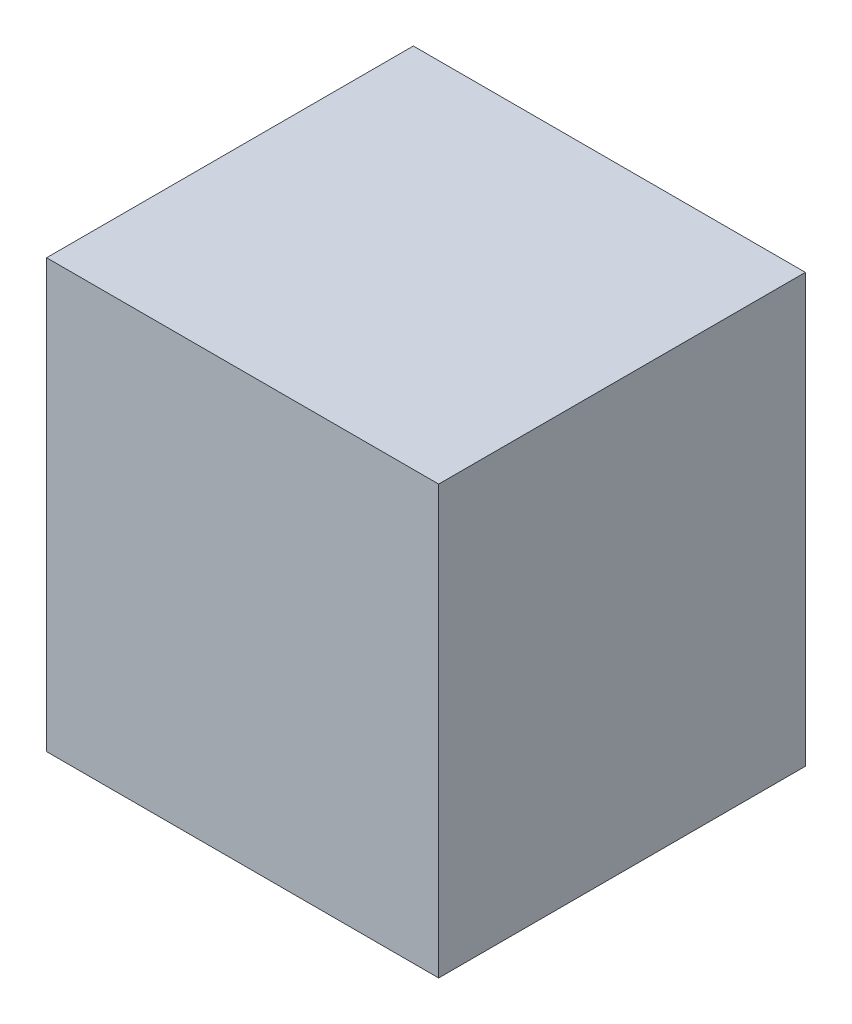
ISO-10303-21;
HEADER;
FILE_DESCRIPTION(('STEP AP214'),'2;1');
FILE_NAME('part.step','',(''),(''),'','','');
FILE_SCHEMA(('AUTOMOTIVE_DESIGN { 1 0 10303 214 1 1 1 1 }'));
ENDSEC;
DATA;
#1=APPLICATION_CONTEXT('core data for automotive mechanical design processes');
#2=APPLICATION_PROTOCOL_DEFINITION('international standard','automotive_design',2000,#1);
#3=PRODUCT_CONTEXT('',#1,'mechanical');
#4=PRODUCT('Part','Part','',(#3));
#5=PRODUCT_RELATED_PRODUCT_CATEGORY('part','',(#4));
#6=PRODUCT_DEFINITION_FORMATION('','',#4);
#7=PRODUCT_DEFINITION_CONTEXT('part definition',#1,'design');
#8=PRODUCT_DEFINITION('design','',#6,#7);
#9=PRODUCT_DEFINITION_SHAPE('','',#8);
#10=(LENGTH_UNIT() NAMED_UNIT(*) SI_UNIT(.MILLI.,.METRE.));
#11=(NAMED_UNIT(*) PLANE_ANGLE_UNIT() SI_UNIT($,.RADIAN.));
#12=(NAMED_UNIT(*) SI_UNIT($,.STERADIAN.) SOLID_ANGLE_UNIT());
#13=UNCERTAINTY_MEASURE_WITH_UNIT(LENGTH_MEASURE(1.E-05),#10,'distance_accuracy_value','');
#14=(GEOMETRIC_REPRESENTATION_CONTEXT(3) GLOBAL_UNCERTAINTY_ASSIGNED_CONTEXT((#13)) GLOBAL_UNIT_ASSIGNED_CONTEXT((#10,
#11,#12)) REPRESENTATION_CONTEXT('',''));
#15=CARTESIAN_POINT('',(0.,0.,0.));
#16=DIRECTION('',(0.,0.,1.));
#17=DIRECTION('',(1.,0.,0.));
#18=AXIS2_PLACEMENT_3D('',#15,#16,#17);
#19=CARTESIAN_POINT('',(4.97886673532662,0.,0.));
#20=DIRECTION('',(0.,1.,0.));
#21=DIRECTION('',(0.,0.,1.));
#22=AXIS2_PLACEMENT_3D('',#19,#20,#21);
#23=PLANE('',#22);
#24=CARTESIAN_POINT('',(-2.48072386230037,0.,33.924));
#25=DIRECTION('',(0.,-1.,0.));
#26=DIRECTION('',(0.,0.,-1.));
#27=AXIS2_PLACEMENT_3D('',#24,#25,#26);
#28=CIRCLE('',#27,2.79999999999999);
#29=CARTESIAN_POINT('',(-2.48072386230037,0.,31.124));
#30=VERTEX_POINT('',#29);
#31=EDGE_CURVE('E135',#30,#30,#28,.T.);
#32=ORIENTED_EDGE('',*,*,#31,.F.);
#33=EDGE_LOOP('',(#32));
#34=FACE_BOUND('',#33,.T.);
#35=CARTESIAN_POINT('',(-2.48072386230037,0.,75.924));
#36=DIRECTION('',(0.,-1.,0.));
#37=DIRECTION('',(0.,0.,-1.));
#38=AXIS2_PLACEMENT_3D('',#35,#36,#37);
#39=CIRCLE('',#38,2.79999999999999);
#40=CARTESIAN_POINT('',(-2.48072386230037,0.,73.124));
#41=VERTEX_POINT('',#40);
#42=EDGE_CURVE('E141',#41,#41,#39,.T.);
#43=ORIENTED_EDGE('',*,*,#42,.F.);
#44=EDGE_LOOP('',(#43));
#45=FACE_BOUND('',#44,.T.);
#46=CARTESIAN_POINT('',(-97.538,0.,75.924));
#47=DIRECTION('',(0.,-1.,0.));
#48=DIRECTION('',(0.,0.,-1.));
#49=AXIS2_PLACEMENT_3D('',#46,#47,#48);
#50=CIRCLE('',#49,2.79999999999999);
#51=CARTESIAN_POINT('',(-97.538,0.,73.124));
#52=VERTEX_POINT('',#51);
#53=EDGE_CURVE('E129',#52,#52,#50,.T.);
#54=ORIENTED_EDGE('',*,*,#53,.F.);
#55=EDGE_LOOP('',(#54));
#56=FACE_BOUND('',#55,.T.);
#57=CARTESIAN_POINT('',(-97.538,0.,33.924));
#58=DIRECTION('',(0.,-1.,0.));
#59=DIRECTION('',(0.,0.,-1.));
#60=AXIS2_PLACEMENT_3D('',#57,#58,#59);
#61=CIRCLE('',#60,2.79999999999999);
#62=CARTESIAN_POINT('',(-97.538,0.,31.124));
#63=VERTEX_POINT('',#62);
#64=EDGE_CURVE('E126',#63,#63,#61,.T.);
#65=ORIENTED_EDGE('',*,*,#64,.F.);
#66=EDGE_LOOP('',(#65));
#67=FACE_BOUND('',#66,.T.);
#68=DIRECTION('',(-1.,0.,0.));
#69=VECTOR('',#68,1.);
#70=CARTESIAN_POINT('',(4.97886673532662,0.,26.924));
#71=LINE('',#70,#69);
#72=CARTESIAN_POINT('',(4.97886673532662,0.,26.924));
#73=VERTEX_POINT('',#72);
#74=CARTESIAN_POINT('',(-104.997590597627,0.,26.924));
#75=VERTEX_POINT('',#74);
#76=EDGE_CURVE('E57',#73,#75,#71,.T.);
#77=ORIENTED_EDGE('',*,*,#76,.F.);
#78=DIRECTION('',(0.,0.,-1.));
#79=VECTOR('',#78,1.);
#80=CARTESIAN_POINT('',(4.97886673532662,0.,0.));
#81=LINE('',#80,#79);
#82=CARTESIAN_POINT('',(4.97886673532662,0.,129.794));
#83=VERTEX_POINT('',#82);
#84=EDGE_CURVE('E103',#83,#73,#81,.T.);
#85=ORIENTED_EDGE('',*,*,#84,.F.);
#86=DIRECTION('',(-1.,0.,0.));
#87=VECTOR('',#86,1.);
#88=CARTESIAN_POINT('',(4.97886673532662,0.,129.794));
#89=LINE('',#88,#87);
#90=CARTESIAN_POINT('',(-104.997590597627,0.,129.794));
#91=VERTEX_POINT('',#90);
#92=EDGE_CURVE('E112',#83,#91,#89,.T.);
#93=ORIENTED_EDGE('',*,*,#92,.T.);
#94=DIRECTION('',(0.,0.,-1.));
#95=VECTOR('',#94,1.);
#96=CARTESIAN_POINT('',(-104.997590597627,0.,0.));
#97=LINE('',#96,#95);
#98=EDGE_CURVE('E101',#91,#75,#97,.T.);
#99=ORIENTED_EDGE('',*,*,#98,.T.);
#100=EDGE_LOOP('',(#77,#85,#93,#99));
#101=FACE_BOUND('',#100,.T.);
#102=ADVANCED_FACE('F43',(#34,#45,#56,#67,#101),#23,.F.);
#103=CARTESIAN_POINT('',(4.97886673532662,119.988,0.));
#104=DIRECTION('',(0.,-1.,0.));
#105=DIRECTION('',(0.,0.,-1.));
#106=AXIS2_PLACEMENT_3D('',#103,#104,#105);
#107=PLANE('',#106);
#108=DIRECTION('',(1.,0.,0.));
#109=VECTOR('',#108,1.);
#110=CARTESIAN_POINT('',(4.97886673532662,119.988,26.924));
#111=LINE('',#110,#109);
#112=CARTESIAN_POINT('',(-104.997590597627,119.988,26.924));
#113=VERTEX_POINT('',#112);
#114=CARTESIAN_POINT('',(4.97886673532662,119.988,26.924));
#115=VERTEX_POINT('',#114);
#116=EDGE_CURVE('E82',#113,#115,#111,.T.);
#117=ORIENTED_EDGE('',*,*,#116,.F.);
#118=DIRECTION('',(0.,0.,1.));
#119=VECTOR('',#118,1.);
#120=CARTESIAN_POINT('',(-104.997590597627,119.988,0.));
#121=LINE('',#120,#119);
#122=CARTESIAN_POINT('',(-104.997590597627,119.988,129.794));
#123=VERTEX_POINT('',#122);
#124=EDGE_CURVE('E92',#113,#123,#121,.T.);
#125=ORIENTED_EDGE('',*,*,#124,.T.);
#126=DIRECTION('',(-1.,0.,0.));
#127=VECTOR('',#126,1.);
#128=CARTESIAN_POINT('',(4.97886673532662,119.988,129.794));
#129=LINE('',#128,#127);
#130=CARTESIAN_POINT('',(4.97886673532662,119.988,129.794));
#131=VERTEX_POINT('',#130);
#132=EDGE_CURVE('E50',#131,#123,#129,.T.);
#133=ORIENTED_EDGE('',*,*,#132,.F.);
#134=DIRECTION('',(0.,0.,1.));
#135=VECTOR('',#134,1.);
#136=CARTESIAN_POINT('',(4.97886673532662,119.988,0.));
#137=LINE('',#136,#135);
#138=EDGE_CURVE('E94',#115,#131,#137,.T.);
#139=ORIENTED_EDGE('',*,*,#138,.F.);
#140=EDGE_LOOP('',(#117,#125,#133,#139));
#141=FACE_BOUND('',#140,.T.);
#142=ADVANCED_FACE('F90',(#141),#107,.F.);
#143=CARTESIAN_POINT('',(4.97886673532662,0.,0.));
#144=DIRECTION('',(-1.,0.,0.));
#145=DIRECTION('',(0.,0.,1.));
#146=AXIS2_PLACEMENT_3D('',#143,#144,#145);
#147=PLANE('',#146);
#148=DIRECTION('',(0.,-1.,0.));
#149=VECTOR('',#148,1.);
#150=CARTESIAN_POINT('',(4.97886673532662,0.,26.924));
#151=LINE('',#150,#149);
#152=EDGE_CURVE('E105',#115,#73,#151,.T.);
#153=ORIENTED_EDGE('',*,*,#152,.F.);
#154=ORIENTED_EDGE('',*,*,#138,.T.);
#155=DIRECTION('',(0.,-1.,0.));
#156=VECTOR('',#155,1.);
#157=CARTESIAN_POINT('',(4.97886673532662,0.,129.794));
#158=LINE('',#157,#156);
#159=EDGE_CURVE('E64',#131,#83,#158,.T.);
#160=ORIENTED_EDGE('',*,*,#159,.T.);
#161=ORIENTED_EDGE('',*,*,#84,.T.);
#162=EDGE_LOOP('',(#153,#154,#160,#161));
#163=FACE_BOUND('',#162,.T.);
#164=ADVANCED_FACE('F117',(#163),#147,.F.);
#165=CARTESIAN_POINT('',(-104.997590597627,0.,0.));
#166=DIRECTION('',(-1.,0.,0.));
#167=DIRECTION('',(0.,0.,1.));
#168=AXIS2_PLACEMENT_3D('',#165,#166,#167);
#169=PLANE('',#168);
#170=ORIENTED_EDGE('',*,*,#124,.F.);
#171=DIRECTION('',(0.,-1.,0.));
#172=VECTOR('',#171,1.);
#173=CARTESIAN_POINT('',(-104.997590597627,0.,26.924));
#174=LINE('',#173,#172);
#175=EDGE_CURVE('E12',#113,#75,#174,.T.);
#176=ORIENTED_EDGE('',*,*,#175,.T.);
#177=ORIENTED_EDGE('',*,*,#98,.F.);
#178=DIRECTION('',(0.,-1.,0.));
#179=VECTOR('',#178,1.);
#180=CARTESIAN_POINT('',(-104.997590597627,0.,129.794));
#181=LINE('',#180,#179);
#182=EDGE_CURVE('E100',#123,#91,#181,.T.);
#183=ORIENTED_EDGE('',*,*,#182,.F.);
#184=EDGE_LOOP('',(#170,#176,#177,#183));
#185=FACE_BOUND('',#184,.T.);
#186=ADVANCED_FACE('F98',(#185),#169,.T.);
#187=CARTESIAN_POINT('',(4.97886673532662,0.,129.794));
#188=DIRECTION('',(0.,0.,-1.));
#189=DIRECTION('',(-1.,0.,0.));
#190=AXIS2_PLACEMENT_3D('',#187,#188,#189);
#191=PLANE('',#190);
#192=ORIENTED_EDGE('',*,*,#132,.T.);
#193=ORIENTED_EDGE('',*,*,#182,.T.);
#194=ORIENTED_EDGE('',*,*,#92,.F.);
#195=ORIENTED_EDGE('',*,*,#159,.F.);
#196=EDGE_LOOP('',(#192,#193,#194,#195));
#197=FACE_BOUND('',#196,.T.);
#198=ADVANCED_FACE('F114',(#197),#191,.F.);
#199=CARTESIAN_POINT('',(-50.0093619311502,59.994,26.924));
#200=DIRECTION('',(0.,0.,-1.));
#201=DIRECTION('',(-1.,0.,0.));
#202=AXIS2_PLACEMENT_3D('',#199,#200,#201);
#203=PLANE('',#202);
#204=CARTESIAN_POINT('',(-50.038,59.994,26.924));
#205=DIRECTION('',(0.,0.,-1.));
#206=DIRECTION('',(-1.,0.,0.));
#207=AXIS2_PLACEMENT_3D('',#204,#205,#206);
#208=CIRCLE('',#207,4.00000000000001);
#209=CARTESIAN_POINT('',(-54.038,59.994,26.924));
#210=VERTEX_POINT('',#209);
#211=EDGE_CURVE('E95',#210,#210,#208,.T.);
#212=ORIENTED_EDGE('',*,*,#211,.F.);
#213=EDGE_LOOP('',(#212));
#214=FACE_BOUND('',#213,.T.);
#215=ORIENTED_EDGE('',*,*,#152,.T.);
#216=ORIENTED_EDGE('',*,*,#76,.T.);
#217=ORIENTED_EDGE('',*,*,#175,.F.);
#218=ORIENTED_EDGE('',*,*,#116,.T.);
#219=EDGE_LOOP('',(#215,#216,#217,#218));
#220=FACE_BOUND('',#219,.T.);
#221=ADVANCED_FACE('F81',(#214,#220),#203,.T.);
#222=CARTESIAN_POINT('',(-50.038,59.994,26.924));
#223=DIRECTION('',(0.,0.,-1.));
#224=DIRECTION('',(-1.,0.,0.));
#225=AXIS2_PLACEMENT_3D('',#222,#223,#224);
#226=CYLINDRICAL_SURFACE('',#225,4.00000000000001);
#227=ORIENTED_EDGE('',*,*,#211,.T.);
#228=EDGE_LOOP('',(#227));
#229=FACE_BOUND('',#228,.T.);
#230=CARTESIAN_POINT('',(-50.038,59.994,0.));
#231=DIRECTION('',(0.,0.,-1.));
#232=DIRECTION('',(-1.,0.,0.));
#233=AXIS2_PLACEMENT_3D('',#230,#231,#232);
#234=CIRCLE('',#233,4.00000000000001);
#235=CARTESIAN_POINT('',(-54.038,59.994,0.));
#236=VERTEX_POINT('',#235);
#237=EDGE_CURVE('E120',#236,#236,#234,.T.);
#238=ORIENTED_EDGE('',*,*,#237,.F.);
#239=EDGE_LOOP('',(#238));
#240=FACE_BOUND('',#239,.T.);
#241=ADVANCED_FACE('F169',(#229,#240),#226,.T.);
#242=CARTESIAN_POINT('',(4.97886673532662,0.,0.));
#243=DIRECTION('',(0.,0.,1.));
#244=DIRECTION('',(1.,0.,0.));
#245=AXIS2_PLACEMENT_3D('',#242,#243,#244);
#246=PLANE('',#245);
#247=ORIENTED_EDGE('',*,*,#237,.T.);
#248=EDGE_LOOP('',(#247));
#249=FACE_BOUND('',#248,.T.);
#250=ADVANCED_FACE('F160',(#249),#246,.F.);
#251=CARTESIAN_POINT('',(-97.538,5.,33.924));
#252=DIRECTION('',(0.,-1.,0.));
#253=DIRECTION('',(0.,0.,-1.));
#254=AXIS2_PLACEMENT_3D('',#251,#252,#253);
#255=CYLINDRICAL_SURFACE('',#254,2.79999999999999);
#256=CARTESIAN_POINT('',(-97.538,5.,33.924));
#257=DIRECTION('',(0.,-1.,0.));
#258=DIRECTION('',(0.,0.,-1.));
#259=AXIS2_PLACEMENT_3D('',#256,#257,#258);
#260=CIRCLE('',#259,2.79999999999999);
#261=CARTESIAN_POINT('',(-97.538,5.,31.124));
#262=VERTEX_POINT('',#261);
#263=EDGE_CURVE('E123',#262,#262,#260,.T.);
#264=ORIENTED_EDGE('',*,*,#263,.F.);
#265=EDGE_LOOP('',(#264));
#266=FACE_BOUND('',#265,.T.);
#267=ORIENTED_EDGE('',*,*,#64,.T.);
#268=EDGE_LOOP('',(#267));
#269=FACE_BOUND('',#268,.T.);
#270=ADVANCED_FACE('F157',(#266,#269),#255,.F.);
#271=CARTESIAN_POINT('',(-97.538,5.,33.924));
#272=DIRECTION('',(0.,-1.,0.));
#273=DIRECTION('',(0.,0.,-1.));
#274=AXIS2_PLACEMENT_3D('',#271,#272,#273);
#275=PLANE('',#274);
#276=ORIENTED_EDGE('',*,*,#263,.T.);
#277=EDGE_LOOP('',(#276));
#278=FACE_BOUND('',#277,.T.);
#279=ADVANCED_FACE('F159',(#278),#275,.T.);
#280=CARTESIAN_POINT('',(-97.538,5.,75.924));
#281=DIRECTION('',(0.,-1.,0.));
#282=DIRECTION('',(0.,0.,-1.));
#283=AXIS2_PLACEMENT_3D('',#280,#281,#282);
#284=CYLINDRICAL_SURFACE('',#283,2.79999999999999);
#285=CARTESIAN_POINT('',(-97.538,5.,75.924));
#286=DIRECTION('',(0.,-1.,0.));
#287=DIRECTION('',(0.,0.,-1.));
#288=AXIS2_PLACEMENT_3D('',#285,#286,#287);
#289=CIRCLE('',#288,2.79999999999999);
#290=CARTESIAN_POINT('',(-97.538,5.,73.124));
#291=VERTEX_POINT('',#290);
#292=EDGE_CURVE('E144',#291,#291,#289,.T.);
#293=ORIENTED_EDGE('',*,*,#292,.F.);
#294=EDGE_LOOP('',(#293));
#295=FACE_BOUND('',#294,.T.);
#296=ORIENTED_EDGE('',*,*,#53,.T.);
#297=EDGE_LOOP('',(#296));
#298=FACE_BOUND('',#297,.T.);
#299=ADVANCED_FACE('F150',(#295,#298),#284,.F.);
#300=CARTESIAN_POINT('',(-97.538,5.,75.924));
#301=DIRECTION('',(0.,-1.,0.));
#302=DIRECTION('',(0.,0.,-1.));
#303=AXIS2_PLACEMENT_3D('',#300,#301,#302);
#304=PLANE('',#303);
#305=ORIENTED_EDGE('',*,*,#292,.T.);
#306=EDGE_LOOP('',(#305));
#307=FACE_BOUND('',#306,.T.);
#308=ADVANCED_FACE('F238',(#307),#304,.T.);
#309=CARTESIAN_POINT('',(-2.48072386230037,5.,75.924));
#310=DIRECTION('',(0.,-1.,0.));
#311=DIRECTION('',(0.,0.,-1.));
#312=AXIS2_PLACEMENT_3D('',#309,#310,#311);
#313=CYLINDRICAL_SURFACE('',#312,2.79999999999999);
#314=CARTESIAN_POINT('',(-2.48072386230037,5.,75.924));
#315=DIRECTION('',(0.,-1.,0.));
#316=DIRECTION('',(0.,0.,-1.));
#317=AXIS2_PLACEMENT_3D('',#314,#315,#316);
#318=CIRCLE('',#317,2.79999999999999);
#319=CARTESIAN_POINT('',(-2.48072386230037,5.,73.124));
#320=VERTEX_POINT('',#319);
#321=EDGE_CURVE('E138',#320,#320,#318,.T.);
#322=ORIENTED_EDGE('',*,*,#321,.F.);
#323=EDGE_LOOP('',(#322));
#324=FACE_BOUND('',#323,.T.);
#325=ORIENTED_EDGE('',*,*,#42,.T.);
#326=EDGE_LOOP('',(#325));
#327=FACE_BOUND('',#326,.T.);
#328=ADVANCED_FACE('F247',(#324,#327),#313,.F.);
#329=CARTESIAN_POINT('',(-2.48072386230037,5.,75.924));
#330=DIRECTION('',(0.,-1.,0.));
#331=DIRECTION('',(0.,0.,-1.));
#332=AXIS2_PLACEMENT_3D('',#329,#330,#331);
#333=PLANE('',#332);
#334=ORIENTED_EDGE('',*,*,#321,.T.);
#335=EDGE_LOOP('',(#334));
#336=FACE_BOUND('',#335,.T.);
#337=ADVANCED_FACE('F256',(#336),#333,.T.);
#338=CARTESIAN_POINT('',(-2.48072386230037,5.,33.924));
#339=DIRECTION('',(0.,-1.,0.));
#340=DIRECTION('',(0.,0.,-1.));
#341=AXIS2_PLACEMENT_3D('',#338,#339,#340);
#342=CYLINDRICAL_SURFACE('',#341,2.79999999999999);
#343=CARTESIAN_POINT('',(-2.48072386230037,5.,33.924));
#344=DIRECTION('',(0.,-1.,0.));
#345=DIRECTION('',(0.,0.,-1.));
#346=AXIS2_PLACEMENT_3D('',#343,#344,#345);
#347=CIRCLE('',#346,2.79999999999999);
#348=CARTESIAN_POINT('',(-2.48072386230037,5.,31.124));
#349=VERTEX_POINT('',#348);
#350=EDGE_CURVE('E132',#349,#349,#347,.T.);
#351=ORIENTED_EDGE('',*,*,#350,.F.);
#352=EDGE_LOOP('',(#351));
#353=FACE_BOUND('',#352,.T.);
#354=ORIENTED_EDGE('',*,*,#31,.T.);
#355=EDGE_LOOP('',(#354));
#356=FACE_BOUND('',#355,.T.);
#357=ADVANCED_FACE('F265',(#353,#356),#342,.F.);
#358=CARTESIAN_POINT('',(-2.48072386230037,5.,33.924));
#359=DIRECTION('',(0.,-1.,0.));
#360=DIRECTION('',(0.,0.,-1.));
#361=AXIS2_PLACEMENT_3D('',#358,#359,#360);
#362=PLANE('',#361);
#363=ORIENTED_EDGE('',*,*,#350,.T.);
#364=EDGE_LOOP('',(#363));
#365=FACE_BOUND('',#364,.T.);
#366=ADVANCED_FACE('F274',(#365),#362,.T.);
#367=CLOSED_SHELL('',(#102,#142,#164,#186,#198,#221,#241,#250,#270,#279,#299,#308,#328,#337,
#357,#366));
#368=MANIFOLD_SOLID_BREP('B2',#367);
#369=ADVANCED_BREP_SHAPE_REPRESENTATION('',(#18,#368),#14);
#370=SHAPE_DEFINITION_REPRESENTATION(#9,#369);
ENDSEC;
END-ISO-10303-21;
